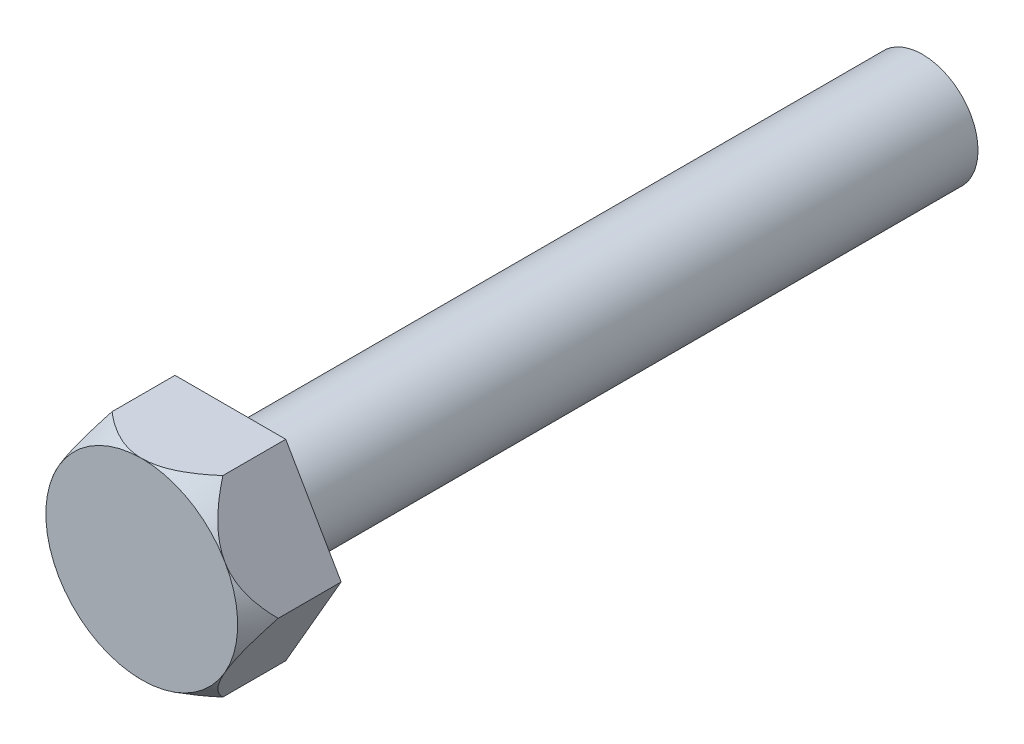
ISO-10303-21;
HEADER;
FILE_DESCRIPTION(('STEP AP214'),'2;1');
FILE_NAME('part.step','',(''),(''),'','','');
FILE_SCHEMA(('AUTOMOTIVE_DESIGN { 1 0 10303 214 1 1 1 1 }'));
ENDSEC;
DATA;
#1=APPLICATION_CONTEXT('core data for automotive mechanical design processes');
#2=APPLICATION_PROTOCOL_DEFINITION('international standard','automotive_design',2000,#1);
#3=PRODUCT_CONTEXT('',#1,'mechanical');
#4=PRODUCT('Part','Part','',(#3));
#5=PRODUCT_RELATED_PRODUCT_CATEGORY('part','',(#4));
#6=PRODUCT_DEFINITION_FORMATION('','',#4);
#7=PRODUCT_DEFINITION_CONTEXT('part definition',#1,'design');
#8=PRODUCT_DEFINITION('design','',#6,#7);
#9=PRODUCT_DEFINITION_SHAPE('','',#8);
#10=(LENGTH_UNIT() NAMED_UNIT(*) SI_UNIT(.MILLI.,.METRE.));
#11=(NAMED_UNIT(*) PLANE_ANGLE_UNIT() SI_UNIT($,.RADIAN.));
#12=(NAMED_UNIT(*) SI_UNIT($,.STERADIAN.) SOLID_ANGLE_UNIT());
#13=UNCERTAINTY_MEASURE_WITH_UNIT(LENGTH_MEASURE(1.E-05),#10,'distance_accuracy_value','');
#14=(GEOMETRIC_REPRESENTATION_CONTEXT(3) GLOBAL_UNCERTAINTY_ASSIGNED_CONTEXT((#13)) GLOBAL_UNIT_ASSIGNED_CONTEXT((#10,
#11,#12)) REPRESENTATION_CONTEXT('',''));
#15=CARTESIAN_POINT('',(0.,0.,0.));
#16=DIRECTION('',(0.,0.,1.));
#17=DIRECTION('',(1.,0.,0.));
#18=AXIS2_PLACEMENT_3D('',#15,#16,#17);
#19=CARTESIAN_POINT('',(7.99999999999999,0.,0.));
#20=DIRECTION('',(0.,0.,1.));
#21=DIRECTION('',(1.,0.,0.));
#22=AXIS2_PLACEMENT_3D('',#19,#20,#21);
#23=PLANE('',#22);
#24=DIRECTION('',(0.5,0.866025403784439,0.));
#25=VECTOR('',#24,1.);
#26=CARTESIAN_POINT('',(4.,-6.92820323027551,0.));
#27=LINE('',#26,#25);
#28=CARTESIAN_POINT('',(4.,-6.92820323027551,0.));
#29=VERTEX_POINT('',#28);
#30=CARTESIAN_POINT('',(7.99999999999999,0.,0.));
#31=VERTEX_POINT('',#30);
#32=EDGE_CURVE('E213',#29,#31,#27,.T.);
#33=ORIENTED_EDGE('',*,*,#32,.F.);
#34=DIRECTION('',(1.,0.,0.));
#35=VECTOR('',#34,1.);
#36=CARTESIAN_POINT('',(-4.00000000000001,-6.92820323027551,0.));
#37=LINE('',#36,#35);
#38=CARTESIAN_POINT('',(-4.00000000000001,-6.92820323027551,0.));
#39=VERTEX_POINT('',#38);
#40=EDGE_CURVE('E231',#39,#29,#37,.T.);
#41=ORIENTED_EDGE('',*,*,#40,.F.);
#42=DIRECTION('',(0.5,-0.866025403784439,0.));
#43=VECTOR('',#42,1.);
#44=CARTESIAN_POINT('',(-8.00000000000001,0.,0.));
#45=LINE('',#44,#43);
#46=CARTESIAN_POINT('',(-8.00000000000001,0.,0.));
#47=VERTEX_POINT('',#46);
#48=EDGE_CURVE('E228',#47,#39,#45,.T.);
#49=ORIENTED_EDGE('',*,*,#48,.F.);
#50=DIRECTION('',(-0.5,-0.866025403784438,0.));
#51=VECTOR('',#50,1.);
#52=CARTESIAN_POINT('',(-4.,6.92820323027551,0.));
#53=LINE('',#52,#51);
#54=CARTESIAN_POINT('',(-4.,6.92820323027551,0.));
#55=VERTEX_POINT('',#54);
#56=EDGE_CURVE('E225',#55,#47,#53,.T.);
#57=ORIENTED_EDGE('',*,*,#56,.F.);
#58=DIRECTION('',(-1.,0.,0.));
#59=VECTOR('',#58,1.);
#60=CARTESIAN_POINT('',(3.99999999999999,6.92820323027551,0.));
#61=LINE('',#60,#59);
#62=CARTESIAN_POINT('',(3.99999999999999,6.92820323027551,0.));
#63=VERTEX_POINT('',#62);
#64=EDGE_CURVE('E223',#63,#55,#61,.T.);
#65=ORIENTED_EDGE('',*,*,#64,.F.);
#66=DIRECTION('',(-0.5,0.866025403784439,0.));
#67=VECTOR('',#66,1.);
#68=CARTESIAN_POINT('',(7.99999999999999,0.,0.));
#69=LINE('',#68,#67);
#70=EDGE_CURVE('E214',#31,#63,#69,.T.);
#71=ORIENTED_EDGE('',*,*,#70,.F.);
#72=EDGE_LOOP('',(#33,#41,#49,#57,#65,#71));
#73=FACE_BOUND('',#72,.T.);
#74=CARTESIAN_POINT('',(0.,0.,0.));
#75=DIRECTION('',(0.,0.,1.));
#76=DIRECTION('',(1.,0.,0.));
#77=AXIS2_PLACEMENT_3D('',#74,#75,#76);
#78=CIRCLE('',#77,4.);
#79=CARTESIAN_POINT('',(4.,0.,0.));
#80=VERTEX_POINT('',#79);
#81=EDGE_CURVE('E12',#80,#80,#78,.F.);
#82=ORIENTED_EDGE('',*,*,#81,.F.);
#83=EDGE_LOOP('',(#82));
#84=FACE_BOUND('',#83,.T.);
#85=ADVANCED_FACE('F33',(#73,#84),#23,.F.);
#86=CARTESIAN_POINT('',(4.,-6.92820323027551,6.4));
#87=DIRECTION('',(-0.866025403784439,0.5,0.));
#88=DIRECTION('',(-0.5,-0.866025403784439,0.));
#89=AXIS2_PLACEMENT_3D('',#86,#87,#88);
#90=PLANE('',#89);
#91=CARTESIAN_POINT('',(3.99988452994616,-6.92840323027551,4.54339353511892));
#92=CARTESIAN_POINT('',(4.04172137832008,-6.85593968326332,4.61585279331116));
#93=CARTESIAN_POINT('',(4.08397568213228,-6.78275308222213,4.68734561064639));
#94=CARTESIAN_POINT('',(4.16941108635941,-6.63477462133557,4.8281289501472));
#95=CARTESIAN_POINT('',(4.21259244771081,-6.55998230953495,4.89741883827627));
#96=CARTESIAN_POINT('',(4.3440737777732,-6.33224996562015,5.10221138464331));
#97=CARTESIAN_POINT('',(4.43388642255892,-6.17668990168916,5.23389264548355));
#98=CARTESIAN_POINT('',(4.6205033231903,-5.85345994824457,5.48700889328953));
#99=CARTESIAN_POINT('',(4.7174282646245,-5.6855810251599,5.60809125922013));
#100=CARTESIAN_POINT('',(4.91652877113471,-5.34072883207152,5.83095626989716));
#101=CARTESIAN_POINT('',(5.01869207303705,-5.16377680250766,5.93278158943772));
#102=CARTESIAN_POINT('',(5.18061390598796,-4.88331996098201,6.07036002767031));
#103=CARTESIAN_POINT('',(5.2384769894785,-4.7830981604938,6.11507493692885));
#104=CARTESIAN_POINT('',(5.35571860872444,-4.58002971919818,6.19583704022874));
#105=CARTESIAN_POINT('',(5.41509725758538,-4.47718288248624,6.23188358525195));
#106=CARTESIAN_POINT('',(5.53466139363047,-4.27009172409307,6.29393095516732));
#107=CARTESIAN_POINT('',(5.59483677203053,-4.16586491133948,6.32000904864052));
#108=CARTESIAN_POINT('',(5.71609309241671,-3.95584280369177,6.36157865268569));
#109=CARTESIAN_POINT('',(5.77717386281651,-3.85004780599387,6.37707214365115));
#110=CARTESIAN_POINT('',(5.90035806736817,-3.63668650502043,6.39694558033513));
#111=CARTESIAN_POINT('',(5.96246573866806,-3.52911286278924,6.40122180461715));
#112=CARTESIAN_POINT('',(6.08660851775777,-3.31409126201305,6.39817613227325));
#113=CARTESIAN_POINT('',(6.14864362579586,-3.20664330303806,6.39085427544448));
#114=CARTESIAN_POINT('',(6.27225012089984,-2.99255057337245,6.36489863106314));
#115=CARTESIAN_POINT('',(6.33382020390293,-2.88590806138486,6.34624024387695));
#116=CARTESIAN_POINT('',(6.45594543709362,-2.67438095261239,6.29833061172774));
#117=CARTESIAN_POINT('',(6.51649995320579,-2.56949745407837,6.26907298912737));
#118=CARTESIAN_POINT('',(6.65352339485069,-2.33216589132145,6.19116570800059));
#119=CARTESIAN_POINT('',(6.72954297696468,-2.20049611272987,6.13935655075726));
#120=CARTESIAN_POINT('',(6.87896137879484,-1.94169584917429,6.02231081485288));
#121=CARTESIAN_POINT('',(6.95235854857717,-1.81456822197953,5.95706595158607));
#122=CARTESIAN_POINT('',(7.09671070977644,-1.56454294460002,5.8152650237508));
#123=CARTESIAN_POINT('',(7.16765465114639,-1.44166443365808,5.73866437768978));
#124=CARTESIAN_POINT('',(7.30687380273703,-1.20052978971647,5.57644808450126));
#125=CARTESIAN_POINT('',(7.37514944966718,-1.08227290031381,5.49083392112575));
#126=CARTESIAN_POINT('',(7.54047496299402,-0.79592071144431,5.27072703241216));
#127=CARTESIAN_POINT('',(7.63612556530093,-0.630249008474184,5.13203220153042));
#128=CARTESIAN_POINT('',(7.77565184638547,-0.388582400644624,4.91612459970591));
#129=CARTESIAN_POINT('',(7.82125544041878,-0.309594658771185,4.84327807999701));
#130=CARTESIAN_POINT('',(7.91143178709802,-0.153404644681788,4.69511068313896));
#131=CARTESIAN_POINT('',(7.95600475050729,-0.0762020074130261,4.61979031965309));
#132=CARTESIAN_POINT('',(8.00011547005383,0.00020000000000189,4.54339353511893));
#133=B_SPLINE_CURVE_WITH_KNOTS('',3,(#91,#92,#93,#94,#95,#96,#97,#98,#99,#100,#101,#102,#103,
#104,#105,#106,#107,#108,#109,#110,#111,#112,#113,#114,#115,#116,#117,#118,#119,#120,#121,#122,
#123,#124,#125,#126,#127,#128,#129,#130,#131,#132),.UNSPECIFIED.,.F.,.F.,(4,2,2,2,2,2,2,2,2,2,2,
2,2,2,2,2,2,2,2,2,4),(0.,0.332046231911006,0.664187182174233,1.33185208993414,2.01676683551847,
2.70014551119821,3.07205710407932,3.44399653407789,3.81299147772154,4.1819173629885,
4.55424272125709,4.92656680194752,5.29970170483889,5.673061499651,6.15414662128211,
6.63552927839406,7.11885445118463,7.60210018587302,8.31028286697047,8.66043686539973,
9.01051861265514),.UNSPECIFIED.);
#134=CARTESIAN_POINT('',(4.,-6.92820323027551,4.54359353944898));
#135=VERTEX_POINT('',#134);
#136=CARTESIAN_POINT('',(6.,-3.46410161513775,6.4));
#137=VERTEX_POINT('',#136);
#138=EDGE_CURVE('E207',#135,#137,#133,.T.);
#139=ORIENTED_EDGE('',*,*,#138,.F.);
#140=DIRECTION('',(0.,0.,-1.));
#141=VECTOR('',#140,1.);
#142=CARTESIAN_POINT('',(4.,-6.92820323027551,6.4));
#143=LINE('',#142,#141);
#144=EDGE_CURVE('E204',#135,#29,#143,.T.);
#145=ORIENTED_EDGE('',*,*,#144,.T.);
#146=ORIENTED_EDGE('',*,*,#32,.T.);
#147=DIRECTION('',(0.,0.,-1.));
#148=VECTOR('',#147,1.);
#149=CARTESIAN_POINT('',(7.99999999999999,0.,6.4));
#150=LINE('',#149,#148);
#151=CARTESIAN_POINT('',(7.99999999999999,0.,4.54359353944899));
#152=VERTEX_POINT('',#151);
#153=EDGE_CURVE('E241',#152,#31,#150,.T.);
#154=ORIENTED_EDGE('',*,*,#153,.F.);
#155=EDGE_CURVE('E212',#137,#152,#133,.T.);
#156=ORIENTED_EDGE('',*,*,#155,.F.);
#157=EDGE_LOOP('',(#139,#145,#146,#154,#156));
#158=FACE_BOUND('',#157,.T.);
#159=ADVANCED_FACE('F35',(#158),#90,.F.);
#160=CARTESIAN_POINT('',(7.99999999999999,0.,6.4));
#161=DIRECTION('',(-0.866025403784438,-0.5,0.));
#162=DIRECTION('',(0.5,-0.866025403784439,0.));
#163=AXIS2_PLACEMENT_3D('',#160,#161,#162);
#164=PLANE('',#163);
#165=CARTESIAN_POINT('',(8.00011547005383,-0.000199999999998462,4.54339353511893));
#166=CARTESIAN_POINT('',(7.95827862167991,0.0722635470121886,4.61585279331116));
#167=CARTESIAN_POINT('',(7.9160243178677,0.145450148053378,4.6873456106464));
#168=CARTESIAN_POINT('',(7.83058891364058,0.293428608939939,4.82812895014721));
#169=CARTESIAN_POINT('',(7.78740755228918,0.368220920740561,4.89741883827627));
#170=CARTESIAN_POINT('',(7.65592622222679,0.595953264655359,5.10221138464332));
#171=CARTESIAN_POINT('',(7.56611357744107,0.75151332858635,5.23389264548355));
#172=CARTESIAN_POINT('',(7.37949667680969,1.07474328203094,5.48700889328953));
#173=CARTESIAN_POINT('',(7.28257173537549,1.24262220511561,5.60809125922013));
#174=CARTESIAN_POINT('',(7.08347122886528,1.58747439820399,5.83095626989716));
#175=CARTESIAN_POINT('',(6.98130792696294,1.76442642776785,5.93278158943772));
#176=CARTESIAN_POINT('',(6.81938609401203,2.0448832692935,6.07036002767032));
#177=CARTESIAN_POINT('',(6.76152301052149,2.14510506978171,6.11507493692885));
#178=CARTESIAN_POINT('',(6.64428139127555,2.34817351107733,6.19583704022874));
#179=CARTESIAN_POINT('',(6.58490274241461,2.45102034778927,6.23188358525195));
#180=CARTESIAN_POINT('',(6.46533860636952,2.65811150618244,6.29393095516732));
#181=CARTESIAN_POINT('',(6.40516322796946,2.76233831893603,6.32000904864052));
#182=CARTESIAN_POINT('',(6.28390690758328,2.97236042658374,6.36157865268569));
#183=CARTESIAN_POINT('',(6.22282613718348,3.07815542428164,6.37707214365115));
#184=CARTESIAN_POINT('',(6.09964193263182,3.29151672525507,6.39694558033513));
#185=CARTESIAN_POINT('',(6.03753426133193,3.39909036748627,6.40122180461715));
#186=CARTESIAN_POINT('',(5.91339148224222,3.61411196826246,6.39817613227325));
#187=CARTESIAN_POINT('',(5.85135637420413,3.72155992723744,6.39085427544448));
#188=CARTESIAN_POINT('',(5.72774987910015,3.93565265690305,6.36489863106313));
#189=CARTESIAN_POINT('',(5.66617979609705,4.04229516889065,6.34624024387695));
#190=CARTESIAN_POINT('',(5.54405456290636,4.25382227766312,6.29833061172773));
#191=CARTESIAN_POINT('',(5.4835000467942,4.35870577619713,6.26907298912737));
#192=CARTESIAN_POINT('',(5.3464766051493,4.59603733895406,6.19116570800059));
#193=CARTESIAN_POINT('',(5.27045702303531,4.72770711754564,6.13935655075725));
#194=CARTESIAN_POINT('',(5.12103862120515,4.98650738110121,6.02231081485288));
#195=CARTESIAN_POINT('',(5.04764145142282,5.11363500829597,5.95706595158607));
#196=CARTESIAN_POINT('',(4.90328929022355,5.36366028567549,5.81526502375079));
#197=CARTESIAN_POINT('',(4.8323453488536,5.48653879661742,5.73866437768977));
#198=CARTESIAN_POINT('',(4.69312619726296,5.72767344055904,5.57644808450125));
#199=CARTESIAN_POINT('',(4.62485055033281,5.84593032996169,5.49083392112575));
#200=CARTESIAN_POINT('',(4.45952503700597,6.1322825188312,5.27072703241215));
#201=CARTESIAN_POINT('',(4.36387443469906,6.29795422180132,5.13203220153042));
#202=CARTESIAN_POINT('',(4.22434815361452,6.53962082963088,4.9161245997059));
#203=CARTESIAN_POINT('',(4.17874455958121,6.61860857150432,4.84327807999701));
#204=CARTESIAN_POINT('',(4.08856821290196,6.77479858559372,4.69511068313896));
#205=CARTESIAN_POINT('',(4.0439952494927,6.85200122286248,4.61979031965308));
#206=CARTESIAN_POINT('',(3.99988452994616,6.92840323027551,4.54339353511892));
#207=B_SPLINE_CURVE_WITH_KNOTS('',3,(#165,#166,#167,#168,#169,#170,#171,#172,#173,#174,#175,
#176,#177,#178,#179,#180,#181,#182,#183,#184,#185,#186,#187,#188,#189,#190,#191,#192,#193,#194,
#195,#196,#197,#198,#199,#200,#201,#202,#203,#204,#205,#206),.UNSPECIFIED.,.F.,.F.,(4,2,2,2,2,2,
2,2,2,2,2,2,2,2,2,2,2,2,2,2,4),(0.,0.332046231911005,0.664187182174232,1.33185208993414,
2.01676683551847,2.70014551119821,3.07205710407931,3.44399653407789,3.81299147772153,
4.18191736298849,4.55424272125709,4.92656680194752,5.29970170483889,5.673061499651,
6.1541466212821,6.63552927839406,7.11885445118462,7.60210018587302,8.31028286697046,
8.66043686539973,9.01051861265514),.UNSPECIFIED.);
#208=CARTESIAN_POINT('',(6.,3.46410161513775,6.4));
#209=VERTEX_POINT('',#208);
#210=EDGE_CURVE('E216',#152,#209,#207,.T.);
#211=ORIENTED_EDGE('',*,*,#210,.F.);
#212=ORIENTED_EDGE('',*,*,#153,.T.);
#213=ORIENTED_EDGE('',*,*,#70,.T.);
#214=DIRECTION('',(0.,0.,-1.));
#215=VECTOR('',#214,1.);
#216=CARTESIAN_POINT('',(3.99999999999999,6.92820323027551,6.4));
#217=LINE('',#216,#215);
#218=CARTESIAN_POINT('',(3.99999999999999,6.92820323027551,4.54359353944899));
#219=VERTEX_POINT('',#218);
#220=EDGE_CURVE('E239',#219,#63,#217,.T.);
#221=ORIENTED_EDGE('',*,*,#220,.F.);
#222=EDGE_CURVE('E109',#209,#219,#207,.T.);
#223=ORIENTED_EDGE('',*,*,#222,.F.);
#224=EDGE_LOOP('',(#211,#212,#213,#221,#223));
#225=FACE_BOUND('',#224,.T.);
#226=ADVANCED_FACE('F158',(#225),#164,.F.);
#227=CARTESIAN_POINT('',(3.99999999999999,6.92820323027551,6.4));
#228=DIRECTION('',(0.,-1.,0.));
#229=DIRECTION('',(1.,0.,0.));
#230=AXIS2_PLACEMENT_3D('',#227,#228,#229);
#231=PLANE('',#230);
#232=CARTESIAN_POINT('',(-7.93586467240976,6.92820323027551,0.153525154255052));
#233=CARTESIAN_POINT('',(-7.76937410867187,6.92820323027551,0.37071028147098));
#234=CARTESIAN_POINT('',(-7.60149353668066,6.92820323027551,0.586845258683317));
#235=CARTESIAN_POINT('',(-7.26235610473189,6.92820323027551,1.01653447774736));
#236=CARTESIAN_POINT('',(-7.09109841682056,6.92820323027551,1.23008806550018));
#237=CARTESIAN_POINT('',(-6.74300819181858,6.92820323027551,1.65608710720323));
#238=CARTESIAN_POINT('',(-6.56613763590009,6.92820323027551,1.86850158706661));
#239=CARTESIAN_POINT('',(-6.20770071651817,6.92820323027551,2.28930426610497));
#240=CARTESIAN_POINT('',(-6.02613482877826,6.92820323027551,2.49769286946666));
#241=CARTESIAN_POINT('',(-5.64248269621354,6.92820323027551,2.92605012631161));
#242=CARTESIAN_POINT('',(-5.43992277437385,6.92820323027551,3.14559648814212));
#243=CARTESIAN_POINT('',(-5.02664321049471,6.92820323027551,3.5770530554545));
#244=CARTESIAN_POINT('',(-4.81592107073875,6.92820323027551,3.78896088455735));
#245=CARTESIAN_POINT('',(-4.38533329811252,6.92820323027551,4.20150519147822));
#246=CARTESIAN_POINT('',(-4.16550932561676,6.92820323027551,4.40218487065362));
#247=CARTESIAN_POINT('',(-3.71359123185693,6.92820323027551,4.78910858361564));
#248=CARTESIAN_POINT('',(-3.48150703217931,6.92820323027551,4.97536399809502));
#249=CARTESIAN_POINT('',(-3.09672549962404,6.92820323027551,5.25779440145256));
#250=CARTESIAN_POINT('',(-2.94884237946754,6.92820323027551,5.36051200722919));
#251=CARTESIAN_POINT('',(-2.64675789837326,6.92820323027551,5.5564389576316));
#252=CARTESIAN_POINT('',(-2.49255402332571,6.92820323027551,5.64964446631417));
#253=CARTESIAN_POINT('',(-2.17911343809208,6.92820323027551,5.82302992806011));
#254=CARTESIAN_POINT('',(-2.01994958269724,6.92820323027551,5.90334036107497));
#255=CARTESIAN_POINT('',(-1.69494951646328,6.92820323027551,6.04909586040389));
#256=CARTESIAN_POINT('',(-1.52911772464724,6.92820323027551,6.11455058691247));
#257=CARTESIAN_POINT('',(-1.24746328504206,6.92820323027551,6.2085389396773));
#258=CARTESIAN_POINT('',(-1.13331806298342,6.92820323027551,6.24211549153832));
#259=CARTESIAN_POINT('',(-0.902749811048956,6.92820323027551,6.30016991836404));
#260=CARTESIAN_POINT('',(-0.786327571842295,6.92820323027551,6.32465089463061));
#261=CARTESIAN_POINT('',(-0.55187919397524,6.92820323027551,6.36368404423646));
#262=CARTESIAN_POINT('',(-0.433853934334088,6.92820323027551,6.3782414514594));
#263=CARTESIAN_POINT('',(-0.196969293941099,6.92820323027551,6.39690030055123));
#264=CARTESIAN_POINT('',(-0.0781099038124129,6.92820323027551,6.40100162468902));
#265=CARTESIAN_POINT('',(0.159694900264487,6.92820323027551,6.39858237437599));
#266=CARTESIAN_POINT('',(0.278640135152947,6.92820323027551,6.39204435307711));
#267=CARTESIAN_POINT('',(0.515488579061101,6.92820323027551,6.36857293346734));
#268=CARTESIAN_POINT('',(0.633391792000918,6.92820323027551,6.35163957428098));
#269=CARTESIAN_POINT('',(0.867446156341822,6.92820323027551,6.30798877157756));
#270=CARTESIAN_POINT('',(0.98359596264388,6.92820323027551,6.28126417815244));
#271=CARTESIAN_POINT('',(1.21347125820812,6.92820323027551,6.21891456514584));
#272=CARTESIAN_POINT('',(1.32719637528765,6.92820323027551,6.18328818969121));
#273=CARTESIAN_POINT('',(1.60717138086167,6.92820323027551,6.08463569470801));
#274=CARTESIAN_POINT('',(1.77171533489908,6.92820323027551,6.01675526324378));
#275=CARTESIAN_POINT('',(2.09413766103393,6.92820323027551,5.86669485641622));
#276=CARTESIAN_POINT('',(2.25201190121,6.92820323027551,5.78450617387982));
#277=CARTESIAN_POINT('',(2.56292252753387,6.92820323027551,5.60780260982511));
#278=CARTESIAN_POINT('',(2.71588801882828,6.92820323027551,5.51316389582973));
#279=CARTESIAN_POINT('',(2.94067705148875,6.92820323027551,5.36434135271957));
#280=CARTESIAN_POINT('',(3.01481787054833,6.92820323027551,5.31359905664106));
#281=CARTESIAN_POINT('',(3.1616489073704,6.92820323027551,5.21005748442284));
#282=CARTESIAN_POINT('',(3.23433914901117,6.92820323027551,5.1572582421853));
#283=CARTESIAN_POINT('',(3.45093201410138,6.92820323027551,4.99568526183418));
#284=CARTESIAN_POINT('',(3.59276577095437,6.92820323027551,4.88413195801516));
#285=CARTESIAN_POINT('',(3.87158505560867,6.92820323027551,4.65509769723972));
#286=CARTESIAN_POINT('',(4.00856932527435,6.92820323027551,4.53761522093692));
#287=CARTESIAN_POINT('',(4.27838265404368,6.92820323027551,4.2977514133767));
#288=CARTESIAN_POINT('',(4.41120794482164,6.92820323027551,4.17536585606523));
#289=CARTESIAN_POINT('',(4.67311403221601,6.92820323027551,3.92664262263003));
#290=CARTESIAN_POINT('',(4.80219445387006,6.92820323027551,3.80030455336744));
#291=CARTESIAN_POINT('',(5.18588060785682,6.92820323027551,3.41504744839429));
#292=CARTESIAN_POINT('',(5.43551173499996,6.92820323027551,3.15117186179205));
#293=CARTESIAN_POINT('',(5.92438939262108,6.92820323027551,2.61429800623915));
#294=CARTESIAN_POINT('',(6.1636407362761,6.92820323027551,2.34130407175521));
#295=CARTESIAN_POINT('',(6.61277846382588,6.92820323027551,1.81348329944036));
#296=CARTESIAN_POINT('',(6.82336289053541,6.92820323027551,1.55924813317699));
#297=CARTESIAN_POINT('',(7.23909966201658,6.92820323027551,1.04632894350276));
#298=CARTESIAN_POINT('',(7.44425124328735,6.92820323027551,0.787644303126284));
#299=CARTESIAN_POINT('',(7.84759402235384,6.92820323027551,0.269921677431176));
#300=CARTESIAN_POINT('',(8.04583938140726,6.92820323027551,0.010925765050031));
#301=CARTESIAN_POINT('',(8.43855693609491,6.92820323027551,-0.509799280058496));
#302=CARTESIAN_POINT('',(8.63303017926915,6.92820323027551,-0.771527621992881));
#303=CARTESIAN_POINT('',(8.82598603452471,6.92820323027551,-1.03435330657736));
#304=B_SPLINE_CURVE_WITH_KNOTS('',3,(#232,#233,#234,#235,#236,#237,#238,#239,#240,#241,#242,
#243,#244,#245,#246,#247,#248,#249,#250,#251,#252,#253,#254,#255,#256,#257,#258,#259,#260,#261,
#262,#263,#264,#265,#266,#267,#268,#269,#270,#271,#272,#273,#274,#275,#276,#277,#278,#279,#280,
#281,#282,#283,#284,#285,#286,#287,#288,#289,#290,#291,#292,#293,#294,#295,#296,#297,#298,#299,
#300,#301,#302,#303),.UNSPECIFIED.,.F.,.F.,(4,2,2,2,2,2,2,2,2,2,2,2,2,2,2,2,2,2,2,2,2,2,2,2,2,2,
2,2,2,2,2,2,2,2,2,4),(0.,0.82098543579279,1.64217471523296,2.47135014181898,3.30044188429988,
4.19642903553711,5.09269256768802,5.98522955430533,6.87705500197873,7.41694348791806,
7.95704884142757,8.49128791249877,9.02517858312065,9.38180140220176,9.73830251241246,
10.0946154512138,10.450932401931,10.8078342452613,11.1647347453421,11.5218963880354,
11.8791124649313,12.4121952743229,12.9456036283079,13.4847877610568,13.7542873407692,
14.02378248052,14.5649037115664,15.1061643156569,15.6479019258667,16.1896935927124,
17.2790161322948,18.367828025326,19.3581057442052,20.3485219003271,21.3269654906859,
22.3051333541741),.UNSPECIFIED.);
#305=CARTESIAN_POINT('',(0.,6.92820323027551,6.4));
#306=VERTEX_POINT('',#305);
#307=EDGE_CURVE('E105',#219,#306,#304,.F.);
#308=ORIENTED_EDGE('',*,*,#307,.F.);
#309=ORIENTED_EDGE('',*,*,#220,.T.);
#310=ORIENTED_EDGE('',*,*,#64,.T.);
#311=DIRECTION('',(0.,0.,-1.));
#312=VECTOR('',#311,1.);
#313=CARTESIAN_POINT('',(-4.,6.92820323027551,6.4));
#314=LINE('',#313,#312);
#315=CARTESIAN_POINT('',(-4.,6.92820323027551,4.54359353944897));
#316=VERTEX_POINT('',#315);
#317=EDGE_CURVE('E133',#316,#55,#314,.T.);
#318=ORIENTED_EDGE('',*,*,#317,.F.);
#319=EDGE_CURVE('E113',#306,#316,#304,.F.);
#320=ORIENTED_EDGE('',*,*,#319,.F.);
#321=EDGE_LOOP('',(#308,#309,#310,#318,#320));
#322=FACE_BOUND('',#321,.T.);
#323=ADVANCED_FACE('F131',(#322),#231,.F.);
#324=CARTESIAN_POINT('',(-4.,6.92820323027551,6.4));
#325=DIRECTION('',(0.866025403784438,-0.5,0.));
#326=DIRECTION('',(0.5,0.866025403784439,0.));
#327=AXIS2_PLACEMENT_3D('',#324,#325,#326);
#328=PLANE('',#327);
#329=CARTESIAN_POINT('',(-3.99988452994617,6.92840323027551,4.54339353511891));
#330=CARTESIAN_POINT('',(-4.04172137832009,6.85593968326332,4.61585279331115));
#331=CARTESIAN_POINT('',(-4.08397568213229,6.78275308222213,4.68734561064638));
#332=CARTESIAN_POINT('',(-4.16941108635941,6.63477462133557,4.82812895014719));
#333=CARTESIAN_POINT('',(-4.21259244771082,6.55998230953495,4.89741883827625));
#334=CARTESIAN_POINT('',(-4.34407377777321,6.33224996562015,5.1022113846433));
#335=CARTESIAN_POINT('',(-4.43388642255892,6.17668990168916,5.23389264548353));
#336=CARTESIAN_POINT('',(-4.62050332319031,5.85345994824457,5.48700889328951));
#337=CARTESIAN_POINT('',(-4.71742826462451,5.6855810251599,5.60809125922011));
#338=CARTESIAN_POINT('',(-4.91652877113472,5.34072883207152,5.83095626989715));
#339=CARTESIAN_POINT('',(-5.01869207303706,5.16377680250767,5.9327815894377));
#340=CARTESIAN_POINT('',(-5.18061390598797,4.88331996098201,6.0703600276703));
#341=CARTESIAN_POINT('',(-5.23847698947851,4.7830981604938,6.11507493692883));
#342=CARTESIAN_POINT('',(-5.35571860872445,4.58002971919818,6.19583704022872));
#343=CARTESIAN_POINT('',(-5.41509725758539,4.47718288248624,6.23188358525193));
#344=CARTESIAN_POINT('',(-5.53466139363048,4.27009172409307,6.2939309551673));
#345=CARTESIAN_POINT('',(-5.59483677203054,4.16586491133948,6.32000904864051));
#346=CARTESIAN_POINT('',(-5.71609309241672,3.95584280369177,6.36157865268568));
#347=CARTESIAN_POINT('',(-5.77717386281652,3.85004780599387,6.37707214365113));
#348=CARTESIAN_POINT('',(-5.90035806736818,3.63668650502043,6.39694558033512));
#349=CARTESIAN_POINT('',(-5.96246573866807,3.52911286278924,6.40122180461713));
#350=CARTESIAN_POINT('',(-6.08660851775778,3.31409126201305,6.39817613227323));
#351=CARTESIAN_POINT('',(-6.14864362579587,3.20664330303806,6.39085427544446));
#352=CARTESIAN_POINT('',(-6.27225012089985,2.99255057337245,6.36489863106312));
#353=CARTESIAN_POINT('',(-6.33382020390295,2.88590806138486,6.34624024387693));
#354=CARTESIAN_POINT('',(-6.45594543709364,2.67438095261239,6.29833061172771));
#355=CARTESIAN_POINT('',(-6.5164999532058,2.56949745407837,6.26907298912735));
#356=CARTESIAN_POINT('',(-6.6535233948507,2.33216589132145,6.19116570800057));
#357=CARTESIAN_POINT('',(-6.72954297696469,2.20049611272987,6.13935655075723));
#358=CARTESIAN_POINT('',(-6.87896137879485,1.94169584917429,6.02231081485285));
#359=CARTESIAN_POINT('',(-6.95235854857718,1.81456822197953,5.95706595158605));
#360=CARTESIAN_POINT('',(-7.09671070977646,1.56454294460002,5.81526502375077));
#361=CARTESIAN_POINT('',(-7.1676546511464,1.44166443365808,5.73866437768975));
#362=CARTESIAN_POINT('',(-7.30687380273704,1.20052978971646,5.57644808450123));
#363=CARTESIAN_POINT('',(-7.37514944966719,1.08227290031381,5.49083392112573));
#364=CARTESIAN_POINT('',(-7.54047496299404,0.795920711444308,5.27072703241213));
#365=CARTESIAN_POINT('',(-7.63612556530094,0.630249008474182,5.13203220153039));
#366=CARTESIAN_POINT('',(-7.77565184638548,0.388582400644622,4.91612459970588));
#367=CARTESIAN_POINT('',(-7.82125544041879,0.309594658771184,4.84327807999699));
#368=CARTESIAN_POINT('',(-7.91143178709804,0.153404644681788,4.69511068313894));
#369=CARTESIAN_POINT('',(-7.95600475050731,0.0762020074130263,4.61979031965306));
#370=CARTESIAN_POINT('',(-8.00011547005385,-0.000200000000001114,4.5433935351189));
#371=B_SPLINE_CURVE_WITH_KNOTS('',3,(#329,#330,#331,#332,#333,#334,#335,#336,#337,#338,#339,
#340,#341,#342,#343,#344,#345,#346,#347,#348,#349,#350,#351,#352,#353,#354,#355,#356,#357,#358,
#359,#360,#361,#362,#363,#364,#365,#366,#367,#368,#369,#370),.UNSPECIFIED.,.F.,.F.,(4,2,2,2,2,2,
2,2,2,2,2,2,2,2,2,2,2,2,2,2,4),(0.,0.332046231911007,0.664187182174234,1.33185208993415,
2.01676683551848,2.70014551119822,3.07205710407932,3.44399653407789,3.81299147772154,
4.1819173629885,4.5542427212571,4.92656680194753,5.2997017048389,5.67306149965101,
6.15414662128212,6.63552927839407,7.11885445118464,7.60210018587303,8.31028286697047,
8.66043686539974,9.01051861265515),.UNSPECIFIED.);
#372=CARTESIAN_POINT('',(-6.,3.46410161513775,6.4));
#373=VERTEX_POINT('',#372);
#374=EDGE_CURVE('E119',#316,#373,#371,.T.);
#375=ORIENTED_EDGE('',*,*,#374,.F.);
#376=ORIENTED_EDGE('',*,*,#317,.T.);
#377=ORIENTED_EDGE('',*,*,#56,.T.);
#378=DIRECTION('',(0.,0.,-1.));
#379=VECTOR('',#378,1.);
#380=CARTESIAN_POINT('',(-8.00000000000001,0.,6.4));
#381=LINE('',#380,#379);
#382=CARTESIAN_POINT('',(-8.00000000000001,0.,4.54359353944897));
#383=VERTEX_POINT('',#382);
#384=EDGE_CURVE('E236',#383,#47,#381,.T.);
#385=ORIENTED_EDGE('',*,*,#384,.F.);
#386=EDGE_CURVE('E134',#373,#383,#371,.T.);
#387=ORIENTED_EDGE('',*,*,#386,.F.);
#388=EDGE_LOOP('',(#375,#376,#377,#385,#387));
#389=FACE_BOUND('',#388,.T.);
#390=ADVANCED_FACE('F157',(#389),#328,.F.);
#391=CARTESIAN_POINT('',(-8.00000000000001,0.,6.4));
#392=DIRECTION('',(0.866025403784439,0.5,0.));
#393=DIRECTION('',(-0.5,0.866025403784439,0.));
#394=AXIS2_PLACEMENT_3D('',#391,#392,#393);
#395=PLANE('',#394);
#396=CARTESIAN_POINT('',(-8.00011547005385,0.000199999999998462,4.5433935351189));
#397=CARTESIAN_POINT('',(-7.95827862167992,-0.0722635470121885,4.61585279331114));
#398=CARTESIAN_POINT('',(-7.91602431786772,-0.145450148053378,4.68734561064637));
#399=CARTESIAN_POINT('',(-7.8305889136406,-0.29342860893994,4.82812895014718));
#400=CARTESIAN_POINT('',(-7.78740755228919,-0.368220920740562,4.89741883827625));
#401=CARTESIAN_POINT('',(-7.6559262222268,-0.59595326465536,5.1022113846433));
#402=CARTESIAN_POINT('',(-7.56611357744109,-0.751513328586352,5.23389264548353));
#403=CARTESIAN_POINT('',(-7.3794966768097,-1.07474328203094,5.48700889328951));
#404=CARTESIAN_POINT('',(-7.2825717353755,-1.24262220511561,5.60809125922011));
#405=CARTESIAN_POINT('',(-7.08347122886529,-1.58747439820399,5.83095626989714));
#406=CARTESIAN_POINT('',(-6.98130792696295,-1.76442642776785,5.9327815894377));
#407=CARTESIAN_POINT('',(-6.81938609401204,-2.04488326929351,6.0703600276703));
#408=CARTESIAN_POINT('',(-6.7615230105215,-2.14510506978172,6.11507493692883));
#409=CARTESIAN_POINT('',(-6.64428139127556,-2.34817351107733,6.19583704022872));
#410=CARTESIAN_POINT('',(-6.58490274241462,-2.45102034778928,6.23188358525193));
#411=CARTESIAN_POINT('',(-6.46533860636953,-2.65811150618245,6.2939309551673));
#412=CARTESIAN_POINT('',(-6.40516322796947,-2.76233831893603,6.3200090486405));
#413=CARTESIAN_POINT('',(-6.28390690758329,-2.97236042658375,6.36157865268567));
#414=CARTESIAN_POINT('',(-6.22282613718349,-3.07815542428165,6.37707214365113));
#415=CARTESIAN_POINT('',(-6.09964193263183,-3.29151672525508,6.39694558033511));
#416=CARTESIAN_POINT('',(-6.03753426133194,-3.39909036748628,6.40122180461713));
#417=CARTESIAN_POINT('',(-5.91339148224223,-3.61411196826247,6.39817613227323));
#418=CARTESIAN_POINT('',(-5.85135637420414,-3.72155992723745,6.39085427544446));
#419=CARTESIAN_POINT('',(-5.72774987910016,-3.93565265690306,6.36489863106311));
#420=CARTESIAN_POINT('',(-5.66617979609706,-4.04229516889066,6.34624024387692));
#421=CARTESIAN_POINT('',(-5.54405456290637,-4.25382227766313,6.29833061172771));
#422=CARTESIAN_POINT('',(-5.48350004679421,-4.35870577619714,6.26907298912734));
#423=CARTESIAN_POINT('',(-5.34647660514931,-4.59603733895407,6.19116570800057));
#424=CARTESIAN_POINT('',(-5.27045702303532,-4.72770711754565,6.13935655075723));
#425=CARTESIAN_POINT('',(-5.12103862120516,-4.98650738110122,6.02231081485285));
#426=CARTESIAN_POINT('',(-5.04764145142283,-5.11363500829598,5.95706595158604));
#427=CARTESIAN_POINT('',(-4.90328929022355,-5.3636602856755,5.81526502375077));
#428=CARTESIAN_POINT('',(-4.83234534885361,-5.48653879661744,5.73866437768975));
#429=CARTESIAN_POINT('',(-4.69312619726297,-5.72767344055905,5.57644808450122));
#430=CARTESIAN_POINT('',(-4.62485055033282,-5.84593032996171,5.49083392112572));
#431=CARTESIAN_POINT('',(-4.45952503700598,-6.13228251883121,5.27072703241213));
#432=CARTESIAN_POINT('',(-4.36387443469907,-6.29795422180133,5.1320322015304));
#433=CARTESIAN_POINT('',(-4.22434815361453,-6.53962082963089,4.91612459970588));
#434=CARTESIAN_POINT('',(-4.17874455958122,-6.61860857150433,4.84327807999699));
#435=CARTESIAN_POINT('',(-4.08856821290198,-6.77479858559372,4.69511068313894));
#436=CARTESIAN_POINT('',(-4.04399524949271,-6.85200122286248,4.61979031965307));
#437=CARTESIAN_POINT('',(-3.99988452994617,-6.92840323027551,4.54339353511891));
#438=B_SPLINE_CURVE_WITH_KNOTS('',3,(#396,#397,#398,#399,#400,#401,#402,#403,#404,#405,#406,
#407,#408,#409,#410,#411,#412,#413,#414,#415,#416,#417,#418,#419,#420,#421,#422,#423,#424,#425,
#426,#427,#428,#429,#430,#431,#432,#433,#434,#435,#436,#437),.UNSPECIFIED.,.F.,.F.,(4,2,2,2,2,2,
2,2,2,2,2,2,2,2,2,2,2,2,2,2,4),(0.,0.332046231911005,0.664187182174233,1.33185208993415,
2.01676683551848,2.70014551119822,3.07205710407932,3.44399653407789,3.81299147772154,
4.1819173629885,4.5542427212571,4.92656680194753,5.2997017048389,5.67306149965101,
6.15414662128212,6.63552927839407,7.11885445118464,7.60210018587304,8.31028286697047,
8.66043686539973,9.01051861265514),.UNSPECIFIED.);
#439=CARTESIAN_POINT('',(-6.,-3.46410161513775,6.4));
#440=VERTEX_POINT('',#439);
#441=EDGE_CURVE('E194',#383,#440,#438,.T.);
#442=ORIENTED_EDGE('',*,*,#441,.F.);
#443=ORIENTED_EDGE('',*,*,#384,.T.);
#444=ORIENTED_EDGE('',*,*,#48,.T.);
#445=DIRECTION('',(0.,0.,-1.));
#446=VECTOR('',#445,1.);
#447=CARTESIAN_POINT('',(-4.00000000000001,-6.92820323027551,6.4));
#448=LINE('',#447,#446);
#449=CARTESIAN_POINT('',(-4.00000000000001,-6.92820323027551,4.54359353944897));
#450=VERTEX_POINT('',#449);
#451=EDGE_CURVE('E234',#450,#39,#448,.T.);
#452=ORIENTED_EDGE('',*,*,#451,.F.);
#453=EDGE_CURVE('E190',#440,#450,#438,.T.);
#454=ORIENTED_EDGE('',*,*,#453,.F.);
#455=EDGE_LOOP('',(#442,#443,#444,#452,#454));
#456=FACE_BOUND('',#455,.T.);
#457=ADVANCED_FACE('F181',(#456),#395,.F.);
#458=CARTESIAN_POINT('',(-4.00000000000001,-6.92820323027551,6.4));
#459=DIRECTION('',(0.,1.,0.));
#460=DIRECTION('',(0.,0.,1.));
#461=AXIS2_PLACEMENT_3D('',#458,#459,#460);
#462=PLANE('',#461);
#463=CARTESIAN_POINT('',(-7.93586466853839,-6.92820323027551,0.153525159306331));
#464=CARTESIAN_POINT('',(-7.7693741049175,-6.92820323027551,0.370710286323842));
#465=CARTESIAN_POINT('',(-7.60149353304397,-6.92820323027551,0.586845263338053));
#466=CARTESIAN_POINT('',(-7.26235610133257,-6.92820323027551,1.01653448200675));
#467=CARTESIAN_POINT('',(-7.09109841354095,-6.92820323027551,1.23008806956233));
#468=CARTESIAN_POINT('',(-6.74300818878405,-6.92820323027551,1.65608711086805));
#469=CARTESIAN_POINT('',(-6.56613763299101,-6.92820323027551,1.86850159053138));
#470=CARTESIAN_POINT('',(-6.2077007138636,-6.92820323027551,2.28930426917186));
#471=CARTESIAN_POINT('',(-6.02613482625276,-6.92820323027551,2.49769287233572));
#472=CARTESIAN_POINT('',(-5.64248269397066,-6.92820323027551,2.92605012876252));
#473=CARTESIAN_POINT('',(-5.43992277228523,-6.92820323027551,3.14559649037324));
#474=CARTESIAN_POINT('',(-5.02664320872383,-6.92820323027551,3.57705305725258));
#475=CARTESIAN_POINT('',(-4.81592106913136,-6.92820323027551,3.7889608861422));
#476=CARTESIAN_POINT('',(-4.38533329684318,-6.92820323027551,4.20150519264971));
#477=CARTESIAN_POINT('',(-4.16550932452187,-6.92820323027551,4.40218487162487));
#478=CARTESIAN_POINT('',(-3.71359123112891,-6.92820323027551,4.7891085842051));
#479=CARTESIAN_POINT('',(-3.48150703164368,-6.92820323027551,4.97536399850287));
#480=CARTESIAN_POINT('',(-3.09672549926389,-6.92820323027551,5.25779440170805));
#481=CARTESIAN_POINT('',(-2.94884237907658,-6.92820323027551,5.36051200749551));
#482=CARTESIAN_POINT('',(-2.64675789791793,-6.92820323027551,5.55643895791418));
#483=CARTESIAN_POINT('',(-2.49255402283682,-6.92820323027551,5.64964446660217));
#484=CARTESIAN_POINT('',(-2.17911343753488,-6.92820323027551,5.82302992835097));
#485=CARTESIAN_POINT('',(-2.01994958210537,-6.92820323027551,5.90334036136343));
#486=CARTESIAN_POINT('',(-1.69494951580008,-6.92820323027551,6.04909586067837));
#487=CARTESIAN_POINT('',(-1.5291177239474,-6.92820323027551,6.11455058717538));
#488=CARTESIAN_POINT('',(-1.24746328430325,-6.92820323027551,6.20853893990422));
#489=CARTESIAN_POINT('',(-1.13331806224296,-6.92820323027551,6.24211549174547));
#490=CARTESIAN_POINT('',(-0.902749810306463,-6.92820323027551,6.3001699185303));
#491=CARTESIAN_POINT('',(-0.786327571099433,-6.92820323027551,6.32465089477575));
#492=CARTESIAN_POINT('',(-0.551879193233142,-6.92820323027551,6.36368404433857));
#493=CARTESIAN_POINT('',(-0.433853933593119,-6.92820323027551,6.37824145153958));
#494=CARTESIAN_POINT('',(-0.196969293204315,-6.92820323027551,6.39690030058746));
#495=CARTESIAN_POINT('',(-0.0781099030786873,-6.92820323027551,6.40100162470323));
#496=CARTESIAN_POINT('',(0.159694900988965,-6.92820323027551,6.39858237434691));
#497=CARTESIAN_POINT('',(0.278640135871233,-6.92820323027551,6.39204435302689));
#498=CARTESIAN_POINT('',(0.51548857976533,-6.92820323027551,6.3685729333766));
#499=CARTESIAN_POINT('',(0.633391792697282,-6.92820323027551,6.35163957417088));
#500=CARTESIAN_POINT('',(0.867446157021289,-6.92820323027551,6.30798877143106));
#501=CARTESIAN_POINT('',(0.983595963314314,-6.92820323027551,6.28126417798889));
#502=CARTESIAN_POINT('',(1.21347125885977,-6.92820323027551,6.21891456495079));
#503=CARTESIAN_POINT('',(1.32719637592955,-6.92820323027551,6.1832881894817));
#504=CARTESIAN_POINT('',(1.60717138152727,-6.92820323027551,6.08463569444862));
#505=CARTESIAN_POINT('',(1.77171533559622,-6.92820323027551,6.01675526294548));
#506=CARTESIAN_POINT('',(2.09413766179075,-6.92820323027551,5.86669485603777));
#507=CARTESIAN_POINT('',(2.25201190199497,-6.92820323027551,5.78450617346015));
#508=CARTESIAN_POINT('',(2.56292252837297,-6.92820323027551,5.60780260932148));
#509=CARTESIAN_POINT('',(2.71588801969335,-6.92820323027551,5.51316389528334));
#510=CARTESIAN_POINT('',(2.94067705239137,-6.92820323027551,5.36434135210884));
#511=CARTESIAN_POINT('',(3.01481787146323,-6.92820323027551,5.31359905600886));
#512=CARTESIAN_POINT('',(3.16164890830946,-6.92820323027551,5.21005748374767));
#513=CARTESIAN_POINT('',(3.23433914996212,-6.92820323027551,5.15725824148863));
#514=CARTESIAN_POINT('',(3.45093201514867,-6.92820323027551,4.99568526102734));
#515=CARTESIAN_POINT('',(3.59276577208331,-6.92820323027551,4.88413195711654));
#516=CARTESIAN_POINT('',(3.87158505689625,-6.92820323027551,4.65509769615332));
#517=CARTESIAN_POINT('',(4.00856932663891,-6.92820323027551,4.5376152197545));
#518=CARTESIAN_POINT('',(4.27838265555863,-6.92820323027551,4.2977514119992));
#519=CARTESIAN_POINT('',(4.41120794640999,-6.92820323027551,4.17536585458865));
#520=CARTESIAN_POINT('',(4.67311403394826,-6.92820323027551,3.9266426209532));
#521=CARTESIAN_POINT('',(4.8021944556728,-6.92820323027551,3.80030455158945));
#522=CARTESIAN_POINT('',(5.1858806098687,-6.92820323027551,3.4150474463092));
#523=CARTESIAN_POINT('',(5.435511737147,-6.92820323027551,3.15117185949878));
#524=CARTESIAN_POINT('',(5.92438939503246,-6.92820323027551,2.61429800352671));
#525=CARTESIAN_POINT('',(6.16364073881669,-6.92820323027551,2.34130406883178));
#526=CARTESIAN_POINT('',(6.61277846659883,-6.92820323027551,1.81348329612509));
#527=CARTESIAN_POINT('',(6.8233628934122,-6.92820323027551,1.5592481296813));
#528=CARTESIAN_POINT('',(7.23909966509942,-6.92820323027551,1.04632893964576));
#529=CARTESIAN_POINT('',(7.44425124647242,-6.92820323027551,0.787644299088406));
#530=CARTESIAN_POINT('',(7.84759402574063,-6.92820323027551,0.269921673034048));
#531=CARTESIAN_POINT('',(8.04583938489359,-6.92820323027551,0.0109257604745393));
#532=CARTESIAN_POINT('',(8.43855693977953,-6.92820323027551,-0.509799284990713));
#533=CARTESIAN_POINT('',(8.63303018305255,-6.92820323027551,-0.77152762710346));
#534=CARTESIAN_POINT('',(8.82598603840668,-6.92820323027551,-1.03435331186627));
#535=B_SPLINE_CURVE_WITH_KNOTS('',3,(#463,#464,#465,#466,#467,#468,#469,#470,#471,#472,#473,
#474,#475,#476,#477,#478,#479,#480,#481,#482,#483,#484,#485,#486,#487,#488,#489,#490,#491,#492,
#493,#494,#495,#496,#497,#498,#499,#500,#501,#502,#503,#504,#505,#506,#507,#508,#509,#510,#511,
#512,#513,#514,#515,#516,#517,#518,#519,#520,#521,#522,#523,#524,#525,#526,#527,#528,#529,#530,
#531,#532,#533,#534),.UNSPECIFIED.,.F.,.F.,(4,2,2,2,2,2,2,2,2,2,2,2,2,2,2,2,2,2,2,2,2,2,2,2,2,2,
2,2,2,2,2,2,2,2,2,4),(0.,0.820985435106829,1.64217471386074,2.47135013974478,3.3004418815239,
4.19642903196283,5.09269256331467,5.98522954914104,6.87705499602543,7.41694348205896,
7.95704883566265,8.4912879068229,9.02517857753337,9.38180139660245,9.7383025068011,
10.094615445591,10.4509323962967,10.8078342396121,11.164734739678,11.5218963823565,
11.8791124592375,12.4121952687608,12.9456036228778,13.4847877557604,13.7542873355396,
14.0237824753571,14.564903706766,15.1061643112193,15.6479019217923,16.1896935890014,
17.279016129316,18.3678280230787,19.3581057425734,20.3485218993111,21.3269654902762,
22.3051333543707),.UNSPECIFIED.);
#536=CARTESIAN_POINT('',(0.,-6.92820323027551,6.4));
#537=VERTEX_POINT('',#536);
#538=EDGE_CURVE('E188',#450,#537,#535,.T.);
#539=ORIENTED_EDGE('',*,*,#538,.F.);
#540=ORIENTED_EDGE('',*,*,#451,.T.);
#541=ORIENTED_EDGE('',*,*,#40,.T.);
#542=ORIENTED_EDGE('',*,*,#144,.F.);
#543=EDGE_CURVE('E127',#537,#135,#535,.T.);
#544=ORIENTED_EDGE('',*,*,#543,.F.);
#545=EDGE_LOOP('',(#539,#540,#541,#542,#544));
#546=FACE_BOUND('',#545,.T.);
#547=ADVANCED_FACE('F177',(#546),#462,.F.);
#548=CARTESIAN_POINT('',(0.,0.,6.4));
#549=DIRECTION('',(0.,0.,-1.));
#550=DIRECTION('',(1.,0.,0.));
#551=AXIS2_PLACEMENT_3D('',#548,#549,#550);
#552=CONICAL_SURFACE('',#551,6.92820323027551,0.5235987755983);
#553=ORIENTED_EDGE('',*,*,#155,.T.);
#554=ORIENTED_EDGE('',*,*,#210,.T.);
#555=CARTESIAN_POINT('',(0.,0.,6.4));
#556=DIRECTION('',(0.,0.,1.));
#557=DIRECTION('',(1.,0.,0.));
#558=AXIS2_PLACEMENT_3D('',#555,#556,#557);
#559=CIRCLE('',#558,6.9282032302755);
#560=EDGE_CURVE('E123',#137,#209,#559,.T.);
#561=ORIENTED_EDGE('',*,*,#560,.F.);
#562=EDGE_LOOP('',(#553,#554,#561));
#563=FACE_BOUND('',#562,.T.);
#564=ADVANCED_FACE('F180',(#563),#552,.T.);
#565=ORIENTED_EDGE('',*,*,#138,.T.);
#566=EDGE_CURVE('E208',#537,#137,#559,.T.);
#567=ORIENTED_EDGE('',*,*,#566,.F.);
#568=ORIENTED_EDGE('',*,*,#543,.T.);
#569=EDGE_LOOP('',(#565,#567,#568));
#570=FACE_BOUND('',#569,.T.);
#571=ADVANCED_FACE('F151',(#570),#552,.T.);
#572=ORIENTED_EDGE('',*,*,#453,.T.);
#573=ORIENTED_EDGE('',*,*,#538,.T.);
#574=EDGE_CURVE('E57',#440,#537,#559,.T.);
#575=ORIENTED_EDGE('',*,*,#574,.F.);
#576=EDGE_LOOP('',(#572,#573,#575));
#577=FACE_BOUND('',#576,.T.);
#578=ADVANCED_FACE('F200',(#577),#552,.T.);
#579=ORIENTED_EDGE('',*,*,#386,.T.);
#580=ORIENTED_EDGE('',*,*,#441,.T.);
#581=EDGE_CURVE('E122',#373,#440,#559,.T.);
#582=ORIENTED_EDGE('',*,*,#581,.F.);
#583=EDGE_LOOP('',(#579,#580,#582));
#584=FACE_BOUND('',#583,.T.);
#585=ADVANCED_FACE('F261',(#584),#552,.T.);
#586=ORIENTED_EDGE('',*,*,#319,.T.);
#587=ORIENTED_EDGE('',*,*,#374,.T.);
#588=EDGE_CURVE('E42',#306,#373,#559,.T.);
#589=ORIENTED_EDGE('',*,*,#588,.F.);
#590=EDGE_LOOP('',(#586,#587,#589));
#591=FACE_BOUND('',#590,.T.);
#592=ADVANCED_FACE('F117',(#591),#552,.T.);
#593=ORIENTED_EDGE('',*,*,#222,.T.);
#594=ORIENTED_EDGE('',*,*,#307,.T.);
#595=CARTESIAN_POINT('',(0.,0.,6.4));
#596=DIRECTION('',(0.,0.,1.));
#597=DIRECTION('',(1.,0.,0.));
#598=AXIS2_PLACEMENT_3D('',#595,#596,#597);
#599=CIRCLE('',#598,6.92820323027551);
#600=EDGE_CURVE('E49',#209,#306,#599,.T.);
#601=ORIENTED_EDGE('',*,*,#600,.F.);
#602=EDGE_LOOP('',(#593,#594,#601));
#603=FACE_BOUND('',#602,.T.);
#604=ADVANCED_FACE('F107',(#603),#552,.T.);
#605=CARTESIAN_POINT('',(7.99999999999999,0.,6.4));
#606=DIRECTION('',(0.,0.,1.));
#607=DIRECTION('',(1.,0.,0.));
#608=AXIS2_PLACEMENT_3D('',#605,#606,#607);
#609=PLANE('',#608);
#610=ORIENTED_EDGE('',*,*,#560,.T.);
#611=ORIENTED_EDGE('',*,*,#600,.T.);
#612=ORIENTED_EDGE('',*,*,#588,.T.);
#613=ORIENTED_EDGE('',*,*,#581,.T.);
#614=ORIENTED_EDGE('',*,*,#574,.T.);
#615=ORIENTED_EDGE('',*,*,#566,.T.);
#616=EDGE_LOOP('',(#610,#611,#612,#613,#614,#615));
#617=FACE_BOUND('',#616,.T.);
#618=ADVANCED_FACE('F125',(#617),#609,.T.);
#619=CARTESIAN_POINT('',(0.,0.,-50.));
#620=DIRECTION('',(0.,0.,1.));
#621=DIRECTION('',(1.,0.,0.));
#622=AXIS2_PLACEMENT_3D('',#619,#620,#621);
#623=CYLINDRICAL_SURFACE('',#622,4.);
#624=CARTESIAN_POINT('',(0.,0.,-50.));
#625=DIRECTION('',(0.,0.,-1.));
#626=DIRECTION('',(-1.,0.,0.));
#627=AXIS2_PLACEMENT_3D('',#624,#625,#626);
#628=CIRCLE('',#627,4.);
#629=CARTESIAN_POINT('',(-4.,0.,-50.));
#630=VERTEX_POINT('',#629);
#631=EDGE_CURVE('E128',#630,#630,#628,.T.);
#632=ORIENTED_EDGE('',*,*,#631,.F.);
#633=EDGE_LOOP('',(#632));
#634=FACE_BOUND('',#633,.T.);
#635=ORIENTED_EDGE('',*,*,#81,.T.);
#636=EDGE_LOOP('',(#635));
#637=FACE_BOUND('',#636,.T.);
#638=ADVANCED_FACE('F260',(#634,#637),#623,.T.);
#639=CARTESIAN_POINT('',(0.,0.,-50.));
#640=DIRECTION('',(0.,0.,-1.));
#641=DIRECTION('',(-1.,0.,0.));
#642=AXIS2_PLACEMENT_3D('',#639,#640,#641);
#643=PLANE('',#642);
#644=ORIENTED_EDGE('',*,*,#631,.T.);
#645=EDGE_LOOP('',(#644));
#646=FACE_BOUND('',#645,.T.);
#647=ADVANCED_FACE('F328',(#646),#643,.T.);
#648=CLOSED_SHELL('',(#85,#159,#226,#323,#390,#457,#547,#564,#571,#578,#585,#592,#604,#618,#638,#647));
#649=MANIFOLD_SOLID_BREP('B2',#648);
#650=ADVANCED_BREP_SHAPE_REPRESENTATION('',(#18,#649),#14);
#651=SHAPE_DEFINITION_REPRESENTATION(#9,#650);
ENDSEC;
END-ISO-10303-21;
